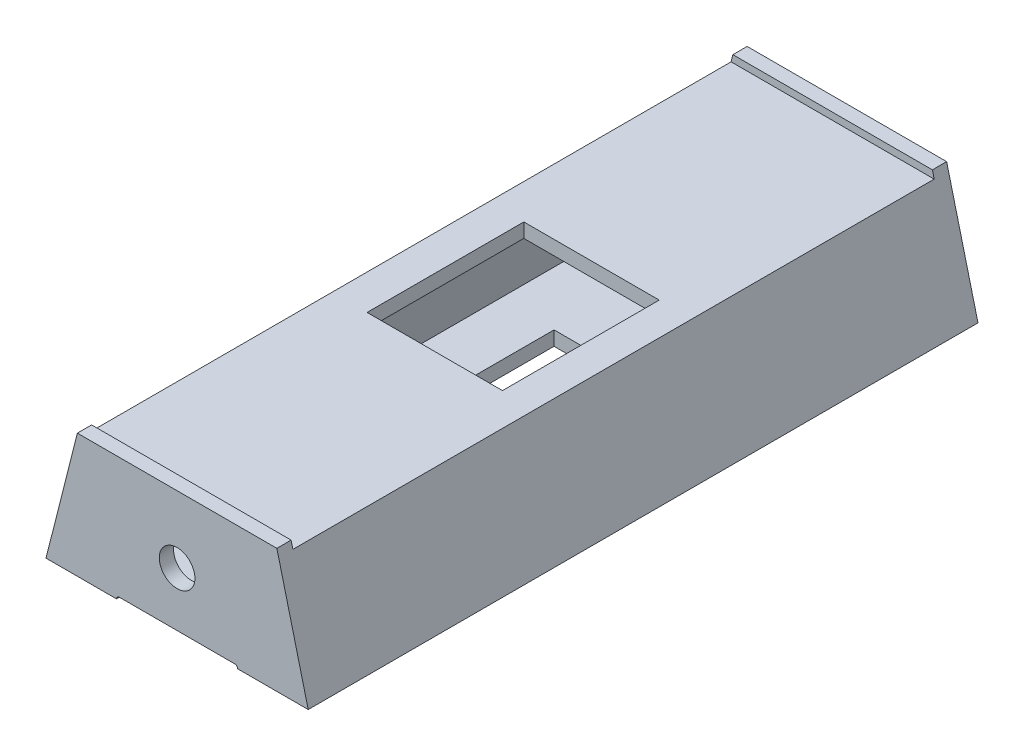
ISO-10303-21;
HEADER;
FILE_DESCRIPTION(('STEP AP214'),'2;1');
FILE_NAME('part.step','',(''),(''),'','','');
FILE_SCHEMA(('AUTOMOTIVE_DESIGN { 1 0 10303 214 1 1 1 1 }'));
ENDSEC;
DATA;
#1=APPLICATION_CONTEXT('core data for automotive mechanical design processes');
#2=APPLICATION_PROTOCOL_DEFINITION('international standard','automotive_design',2000,#1);
#3=PRODUCT_CONTEXT('',#1,'mechanical');
#4=PRODUCT('Part','Part','',(#3));
#5=PRODUCT_RELATED_PRODUCT_CATEGORY('part','',(#4));
#6=PRODUCT_DEFINITION_FORMATION('','',#4);
#7=PRODUCT_DEFINITION_CONTEXT('part definition',#1,'design');
#8=PRODUCT_DEFINITION('design','',#6,#7);
#9=PRODUCT_DEFINITION_SHAPE('','',#8);
#10=(LENGTH_UNIT() NAMED_UNIT(*) SI_UNIT(.MILLI.,.METRE.));
#11=(NAMED_UNIT(*) PLANE_ANGLE_UNIT() SI_UNIT($,.RADIAN.));
#12=(NAMED_UNIT(*) SI_UNIT($,.STERADIAN.) SOLID_ANGLE_UNIT());
#13=UNCERTAINTY_MEASURE_WITH_UNIT(LENGTH_MEASURE(1.E-05),#10,'distance_accuracy_value','');
#14=(GEOMETRIC_REPRESENTATION_CONTEXT(3) GLOBAL_UNCERTAINTY_ASSIGNED_CONTEXT((#13)) GLOBAL_UNIT_ASSIGNED_CONTEXT((#10,
#11,#12)) REPRESENTATION_CONTEXT('',''));
#15=CARTESIAN_POINT('',(0.,0.,0.));
#16=DIRECTION('',(0.,0.,1.));
#17=DIRECTION('',(1.,0.,0.));
#18=AXIS2_PLACEMENT_3D('',#15,#16,#17);
#19=CARTESIAN_POINT('',(-63.4783322972771,32.,460.));
#20=DIRECTION('',(0.,-1.,0.));
#21=DIRECTION('',(0.,0.,-1.));
#22=AXIS2_PLACEMENT_3D('',#19,#20,#21);
#23=PLANE('',#22);
#24=DIRECTION('',(-1.,0.,0.));
#25=VECTOR('',#24,1.);
#26=CARTESIAN_POINT('',(-63.4783322972771,32.,10.));
#27=LINE('',#26,#25);
#28=CARTESIAN_POINT('',(63.4783322972771,32.,10.));
#29=VERTEX_POINT('',#28);
#30=CARTESIAN_POINT('',(-63.4783322972771,32.,10.));
#31=VERTEX_POINT('',#30);
#32=EDGE_CURVE('E308',#29,#31,#27,.T.);
#33=ORIENTED_EDGE('',*,*,#32,.F.);
#34=DIRECTION('',(0.,0.,-1.));
#35=VECTOR('',#34,1.);
#36=CARTESIAN_POINT('',(63.4783322972771,32.,460.));
#37=LINE('',#36,#35);
#38=CARTESIAN_POINT('',(63.4783322972771,32.,460.));
#39=VERTEX_POINT('',#38);
#40=EDGE_CURVE('E329',#39,#29,#37,.T.);
#41=ORIENTED_EDGE('',*,*,#40,.F.);
#42=DIRECTION('',(-1.,0.,0.));
#43=VECTOR('',#42,1.);
#44=CARTESIAN_POINT('',(-63.4783322972771,32.,460.));
#45=LINE('',#44,#43);
#46=CARTESIAN_POINT('',(-63.4783322972771,32.,460.));
#47=VERTEX_POINT('',#46);
#48=EDGE_CURVE('E314',#39,#47,#45,.T.);
#49=ORIENTED_EDGE('',*,*,#48,.T.);
#50=DIRECTION('',(0.,0.,-1.));
#51=VECTOR('',#50,1.);
#52=CARTESIAN_POINT('',(-63.4783322972771,32.,460.));
#53=LINE('',#52,#51);
#54=EDGE_CURVE('E317',#47,#31,#53,.T.);
#55=ORIENTED_EDGE('',*,*,#54,.T.);
#56=EDGE_LOOP('',(#33,#41,#49,#55));
#57=FACE_BOUND('',#56,.T.);
#58=DIRECTION('',(1.,0.,0.));
#59=VECTOR('',#58,1.);
#60=CARTESIAN_POINT('',(-46.6940590360535,32.,290.));
#61=LINE('',#60,#59);
#62=CARTESIAN_POINT('',(-46.6940590360535,32.,290.));
#63=VERTEX_POINT('',#62);
#64=CARTESIAN_POINT('',(48.3059409639465,32.,290.));
#65=VERTEX_POINT('',#64);
#66=EDGE_CURVE('E202',#63,#65,#61,.T.);
#67=ORIENTED_EDGE('',*,*,#66,.T.);
#68=DIRECTION('',(0.,0.,-1.));
#69=VECTOR('',#68,1.);
#70=CARTESIAN_POINT('',(48.3059409639465,32.,290.));
#71=LINE('',#70,#69);
#72=CARTESIAN_POINT('',(48.3059409639465,32.,180.));
#73=VERTEX_POINT('',#72);
#74=EDGE_CURVE('E198',#65,#73,#71,.T.);
#75=ORIENTED_EDGE('',*,*,#74,.T.);
#76=DIRECTION('',(-1.,0.,0.));
#77=VECTOR('',#76,1.);
#78=CARTESIAN_POINT('',(-46.6940590360535,32.,180.));
#79=LINE('',#78,#77);
#80=CARTESIAN_POINT('',(-46.6940590360535,32.,180.));
#81=VERTEX_POINT('',#80);
#82=EDGE_CURVE('E201',#73,#81,#79,.T.);
#83=ORIENTED_EDGE('',*,*,#82,.T.);
#84=DIRECTION('',(0.,0.,1.));
#85=VECTOR('',#84,1.);
#86=CARTESIAN_POINT('',(-46.6940590360535,32.,290.));
#87=LINE('',#86,#85);
#88=EDGE_CURVE('E219',#81,#63,#87,.T.);
#89=ORIENTED_EDGE('',*,*,#88,.T.);
#90=EDGE_LOOP('',(#67,#75,#83,#89));
#91=FACE_BOUND('',#90,.T.);
#92=ADVANCED_FACE('F33',(#57,#91),#23,.T.);
#93=CARTESIAN_POINT('',(78.6507460903805,-28.,460.));
#94=DIRECTION('',(0.,1.,0.));
#95=DIRECTION('',(-1.,0.,0.));
#96=AXIS2_PLACEMENT_3D('',#93,#94,#95);
#97=PLANE('',#96);
#98=DIRECTION('',(1.,0.,0.));
#99=VECTOR('',#98,1.);
#100=CARTESIAN_POINT('',(78.6507460903805,-28.,10.));
#101=LINE('',#100,#99);
#102=CARTESIAN_POINT('',(-78.6507460903805,-28.,10.));
#103=VERTEX_POINT('',#102);
#104=CARTESIAN_POINT('',(78.6507460903805,-28.,10.));
#105=VERTEX_POINT('',#104);
#106=EDGE_CURVE('E320',#103,#105,#101,.T.);
#107=ORIENTED_EDGE('',*,*,#106,.F.);
#108=DIRECTION('',(0.,0.,-1.));
#109=VECTOR('',#108,1.);
#110=CARTESIAN_POINT('',(-78.6507460903805,-28.,460.));
#111=LINE('',#110,#109);
#112=CARTESIAN_POINT('',(-78.6507460903805,-28.,460.));
#113=VERTEX_POINT('',#112);
#114=EDGE_CURVE('E333',#113,#103,#111,.T.);
#115=ORIENTED_EDGE('',*,*,#114,.F.);
#116=DIRECTION('',(1.,0.,0.));
#117=VECTOR('',#116,1.);
#118=CARTESIAN_POINT('',(78.6507460903805,-28.,460.));
#119=LINE('',#118,#117);
#120=CARTESIAN_POINT('',(78.6507460903805,-28.,460.));
#121=VERTEX_POINT('',#120);
#122=EDGE_CURVE('E307',#113,#121,#119,.T.);
#123=ORIENTED_EDGE('',*,*,#122,.T.);
#124=DIRECTION('',(0.,0.,-1.));
#125=VECTOR('',#124,1.);
#126=CARTESIAN_POINT('',(78.6507460903805,-28.,460.));
#127=LINE('',#126,#125);
#128=EDGE_CURVE('E331',#121,#105,#127,.T.);
#129=ORIENTED_EDGE('',*,*,#128,.T.);
#130=EDGE_LOOP('',(#107,#115,#123,#129));
#131=FACE_BOUND('',#130,.T.);
#132=DIRECTION('',(1.,0.,0.));
#133=VECTOR('',#132,1.);
#134=CARTESIAN_POINT('',(-40.5,-28.,165.));
#135=LINE('',#134,#133);
#136=CARTESIAN_POINT('',(-40.5,-28.,165.));
#137=VERTEX_POINT('',#136);
#138=CARTESIAN_POINT('',(40.5,-28.,165.));
#139=VERTEX_POINT('',#138);
#140=EDGE_CURVE('E250',#137,#139,#135,.T.);
#141=ORIENTED_EDGE('',*,*,#140,.T.);
#142=DIRECTION('',(0.,0.,1.));
#143=VECTOR('',#142,1.);
#144=CARTESIAN_POINT('',(40.5,-28.,165.));
#145=LINE('',#144,#143);
#146=CARTESIAN_POINT('',(40.5,-28.,305.));
#147=VERTEX_POINT('',#146);
#148=EDGE_CURVE('E212',#139,#147,#145,.T.);
#149=ORIENTED_EDGE('',*,*,#148,.T.);
#150=DIRECTION('',(-1.,0.,0.));
#151=VECTOR('',#150,1.);
#152=CARTESIAN_POINT('',(-40.5,-28.,305.));
#153=LINE('',#152,#151);
#154=CARTESIAN_POINT('',(-40.5,-28.,305.));
#155=VERTEX_POINT('',#154);
#156=EDGE_CURVE('E230',#147,#155,#153,.T.);
#157=ORIENTED_EDGE('',*,*,#156,.T.);
#158=DIRECTION('',(0.,0.,-1.));
#159=VECTOR('',#158,1.);
#160=CARTESIAN_POINT('',(-40.5,-28.,165.));
#161=LINE('',#160,#159);
#162=EDGE_CURVE('E254',#155,#137,#161,.T.);
#163=ORIENTED_EDGE('',*,*,#162,.T.);
#164=EDGE_LOOP('',(#141,#149,#157,#163));
#165=FACE_BOUND('',#164,.T.);
#166=ADVANCED_FACE('F468',(#131,#165),#97,.T.);
#167=CARTESIAN_POINT('',(0.,-38.,0.));
#168=DIRECTION('',(0.,1.,0.));
#169=DIRECTION('',(0.,0.,1.));
#170=AXIS2_PLACEMENT_3D('',#167,#168,#169);
#171=PLANE('',#170);
#172=DIRECTION('',(0.,0.,1.));
#173=VECTOR('',#172,1.);
#174=CARTESIAN_POINT('',(40.5,-38.,470.));
#175=LINE('',#174,#173);
#176=CARTESIAN_POINT('',(40.5,-38.,0.));
#177=VERTEX_POINT('',#176);
#178=CARTESIAN_POINT('',(40.5,-38.,165.));
#179=VERTEX_POINT('',#178);
#180=EDGE_CURVE('E388',#177,#179,#175,.T.);
#181=ORIENTED_EDGE('',*,*,#180,.T.);
#182=DIRECTION('',(1.,0.,0.));
#183=VECTOR('',#182,1.);
#184=CARTESIAN_POINT('',(-40.5,-38.,165.));
#185=LINE('',#184,#183);
#186=CARTESIAN_POINT('',(-40.5,-38.,165.));
#187=VERTEX_POINT('',#186);
#188=EDGE_CURVE('E235',#187,#179,#185,.T.);
#189=ORIENTED_EDGE('',*,*,#188,.F.);
#190=DIRECTION('',(0.,0.,-1.));
#191=VECTOR('',#190,1.);
#192=CARTESIAN_POINT('',(-40.5,-38.,0.));
#193=LINE('',#192,#191);
#194=CARTESIAN_POINT('',(-40.5,-38.,0.));
#195=VERTEX_POINT('',#194);
#196=EDGE_CURVE('E383',#187,#195,#193,.T.);
#197=ORIENTED_EDGE('',*,*,#196,.T.);
#198=DIRECTION('',(1.,0.,0.));
#199=VECTOR('',#198,1.);
#200=CARTESIAN_POINT('',(-42.5,-38.,0.));
#201=LINE('',#200,#199);
#202=EDGE_CURVE('E265',#195,#177,#201,.T.);
#203=ORIENTED_EDGE('',*,*,#202,.T.);
#204=EDGE_LOOP('',(#181,#189,#197,#203));
#205=FACE_BOUND('',#204,.T.);
#206=ADVANCED_FACE('F474',(#205),#171,.F.);
#207=CARTESIAN_POINT('',(-92.,-40.,10.));
#208=DIRECTION('',(0.,1.,0.));
#209=DIRECTION('',(0.,0.,1.));
#210=AXIS2_PLACEMENT_3D('',#207,#208,#209);
#211=PLANE('',#210);
#212=DIRECTION('',(1.,0.,0.));
#213=VECTOR('',#212,1.);
#214=CARTESIAN_POINT('',(-92.,-40.,470.));
#215=LINE('',#214,#213);
#216=CARTESIAN_POINT('',(42.5,-40.,470.));
#217=VERTEX_POINT('',#216);
#218=CARTESIAN_POINT('',(92.,-40.,470.));
#219=VERTEX_POINT('',#218);
#220=EDGE_CURVE('E284',#217,#219,#215,.T.);
#221=ORIENTED_EDGE('',*,*,#220,.F.);
#222=DIRECTION('',(0.,0.,1.));
#223=VECTOR('',#222,1.);
#224=CARTESIAN_POINT('',(42.5,-40.,0.));
#225=LINE('',#224,#223);
#226=CARTESIAN_POINT('',(42.5,-40.,0.));
#227=VERTEX_POINT('',#226);
#228=EDGE_CURVE('E238',#227,#217,#225,.T.);
#229=ORIENTED_EDGE('',*,*,#228,.F.);
#230=DIRECTION('',(1.,0.,0.));
#231=VECTOR('',#230,1.);
#232=CARTESIAN_POINT('',(-92.,-40.,0.));
#233=LINE('',#232,#231);
#234=CARTESIAN_POINT('',(92.,-40.,0.));
#235=VERTEX_POINT('',#234);
#236=EDGE_CURVE('E365',#227,#235,#233,.T.);
#237=ORIENTED_EDGE('',*,*,#236,.T.);
#238=DIRECTION('',(0.,0.,-1.));
#239=VECTOR('',#238,1.);
#240=CARTESIAN_POINT('',(92.,-40.,10.));
#241=LINE('',#240,#239);
#242=EDGE_CURVE('E377',#219,#235,#241,.T.);
#243=ORIENTED_EDGE('',*,*,#242,.F.);
#244=EDGE_LOOP('',(#221,#229,#237,#243));
#245=FACE_BOUND('',#244,.T.);
#246=ADVANCED_FACE('F425',(#245),#211,.F.);
#247=CARTESIAN_POINT('',(0.,0.,10.));
#248=DIRECTION('',(0.,0.,1.));
#249=DIRECTION('',(1.,0.,0.));
#250=AXIS2_PLACEMENT_3D('',#247,#248,#249);
#251=PLANE('',#250);
#252=CARTESIAN_POINT('',(0.,0.,10.));
#253=DIRECTION('',(0.,0.,1.));
#254=DIRECTION('',(1.,0.,0.));
#255=AXIS2_PLACEMENT_3D('',#252,#253,#254);
#256=CIRCLE('',#255,14.);
#257=CARTESIAN_POINT('',(14.,0.,10.));
#258=VERTEX_POINT('',#257);
#259=EDGE_CURVE('E348',#258,#258,#256,.F.);
#260=ORIENTED_EDGE('',*,*,#259,.T.);
#261=EDGE_LOOP('',(#260));
#262=FACE_BOUND('',#261,.T.);
#263=ORIENTED_EDGE('',*,*,#32,.T.);
#264=DIRECTION('',(-0.245156736408936,-0.969483457617158,0.));
#265=VECTOR('',#264,1.);
#266=CARTESIAN_POINT('',(-78.6507460903805,-28.,10.));
#267=LINE('',#266,#265);
#268=EDGE_CURVE('E303',#31,#103,#267,.T.);
#269=ORIENTED_EDGE('',*,*,#268,.T.);
#270=ORIENTED_EDGE('',*,*,#106,.T.);
#271=DIRECTION('',(-0.245156736408937,0.969483457617158,0.));
#272=VECTOR('',#271,1.);
#273=CARTESIAN_POINT('',(63.4783322972771,32.,10.));
#274=LINE('',#273,#272);
#275=EDGE_CURVE('E323',#105,#29,#274,.T.);
#276=ORIENTED_EDGE('',*,*,#275,.T.);
#277=EDGE_LOOP('',(#263,#269,#270,#276));
#278=FACE_BOUND('',#277,.T.);
#279=ADVANCED_FACE('F456',(#262,#278),#251,.T.);
#280=CARTESIAN_POINT('',(-70.,47.,10.));
#281=DIRECTION('',(0.969483457617158,-0.245156736408936,0.));
#282=DIRECTION('',(0.245156736408936,0.969483457617158,0.));
#283=AXIS2_PLACEMENT_3D('',#280,#281,#282);
#284=PLANE('',#283);
#285=DIRECTION('',(-0.245156736408936,-0.969483457617158,0.));
#286=VECTOR('',#285,1.);
#287=CARTESIAN_POINT('',(-70.,47.,0.));
#288=LINE('',#287,#286);
#289=CARTESIAN_POINT('',(-70.,47.,0.));
#290=VERTEX_POINT('',#289);
#291=CARTESIAN_POINT('',(-92.,-40.,0.));
#292=VERTEX_POINT('',#291);
#293=EDGE_CURVE('E352',#290,#292,#288,.T.);
#294=ORIENTED_EDGE('',*,*,#293,.T.);
#295=DIRECTION('',(0.,0.,-1.));
#296=VECTOR('',#295,1.);
#297=CARTESIAN_POINT('',(-92.,-40.,10.));
#298=LINE('',#297,#296);
#299=CARTESIAN_POINT('',(-92.,-40.,470.));
#300=VERTEX_POINT('',#299);
#301=EDGE_CURVE('E380',#300,#292,#298,.T.);
#302=ORIENTED_EDGE('',*,*,#301,.F.);
#303=DIRECTION('',(-0.245156736408936,-0.969483457617158,0.));
#304=VECTOR('',#303,1.);
#305=CARTESIAN_POINT('',(-70.,47.,470.));
#306=LINE('',#305,#304);
#307=CARTESIAN_POINT('',(-70.,47.,470.));
#308=VERTEX_POINT('',#307);
#309=EDGE_CURVE('E288',#308,#300,#306,.T.);
#310=ORIENTED_EDGE('',*,*,#309,.F.);
#311=DIRECTION('',(0.,0.,-1.));
#312=VECTOR('',#311,1.);
#313=CARTESIAN_POINT('',(-70.,47.,470.));
#314=LINE('',#313,#312);
#315=CARTESIAN_POINT('',(-70.,47.,460.));
#316=VERTEX_POINT('',#315);
#317=EDGE_CURVE('E291',#308,#316,#314,.T.);
#318=ORIENTED_EDGE('',*,*,#317,.T.);
#319=DIRECTION('',(-0.245156736408936,-0.969483457617158,0.));
#320=VECTOR('',#319,1.);
#321=CARTESIAN_POINT('',(-70.,47.,460.));
#322=LINE('',#321,#320);
#323=CARTESIAN_POINT('',(-71.264367816092,42.,460.));
#324=VERTEX_POINT('',#323);
#325=EDGE_CURVE('E295',#316,#324,#322,.T.);
#326=ORIENTED_EDGE('',*,*,#325,.T.);
#327=DIRECTION('',(0.,0.,-1.));
#328=VECTOR('',#327,1.);
#329=CARTESIAN_POINT('',(-71.264367816092,42.,460.));
#330=LINE('',#329,#328);
#331=CARTESIAN_POINT('',(-71.264367816092,42.,10.));
#332=VERTEX_POINT('',#331);
#333=EDGE_CURVE('E340',#324,#332,#330,.T.);
#334=ORIENTED_EDGE('',*,*,#333,.T.);
#335=DIRECTION('',(-0.245156736408936,-0.969483457617158,0.));
#336=VECTOR('',#335,1.);
#337=CARTESIAN_POINT('',(-70.,47.,10.));
#338=LINE('',#337,#336);
#339=CARTESIAN_POINT('',(-70.,47.,10.));
#340=VERTEX_POINT('',#339);
#341=EDGE_CURVE('E355',#340,#332,#338,.T.);
#342=ORIENTED_EDGE('',*,*,#341,.F.);
#343=DIRECTION('',(0.,0.,-1.));
#344=VECTOR('',#343,1.);
#345=CARTESIAN_POINT('',(-70.,47.,10.));
#346=LINE('',#345,#344);
#347=EDGE_CURVE('E362',#340,#290,#346,.T.);
#348=ORIENTED_EDGE('',*,*,#347,.T.);
#349=EDGE_LOOP('',(#294,#302,#310,#318,#326,#334,#342,#348));
#350=FACE_BOUND('',#349,.T.);
#351=ADVANCED_FACE('F439',(#350),#284,.F.);
#352=CARTESIAN_POINT('',(-42.5,-40.,0.));
#353=VERTEX_POINT('',#352);
#354=EDGE_CURVE('E366',#292,#353,#233,.T.);
#355=ORIENTED_EDGE('',*,*,#354,.T.);
#356=DIRECTION('',(0.,0.,-1.));
#357=VECTOR('',#356,1.);
#358=CARTESIAN_POINT('',(-42.5,-40.,0.));
#359=LINE('',#358,#357);
#360=CARTESIAN_POINT('',(-42.5,-40.,470.));
#361=VERTEX_POINT('',#360);
#362=EDGE_CURVE('E266',#361,#353,#359,.T.);
#363=ORIENTED_EDGE('',*,*,#362,.F.);
#364=EDGE_CURVE('E280',#300,#361,#215,.T.);
#365=ORIENTED_EDGE('',*,*,#364,.F.);
#366=ORIENTED_EDGE('',*,*,#301,.T.);
#367=EDGE_LOOP('',(#355,#363,#365,#366));
#368=FACE_BOUND('',#367,.T.);
#369=ADVANCED_FACE('F404',(#368),#211,.F.);
#370=CARTESIAN_POINT('',(70.,47.,10.));
#371=DIRECTION('',(-0.969483457617158,-0.245156736408936,0.));
#372=DIRECTION('',(0.245156736408936,-0.969483457617158,0.));
#373=AXIS2_PLACEMENT_3D('',#370,#371,#372);
#374=PLANE('',#373);
#375=DIRECTION('',(-0.245156736408936,0.969483457617158,0.));
#376=VECTOR('',#375,1.);
#377=CARTESIAN_POINT('',(70.,47.,0.));
#378=LINE('',#377,#376);
#379=CARTESIAN_POINT('',(70.,47.,0.));
#380=VERTEX_POINT('',#379);
#381=EDGE_CURVE('E369',#235,#380,#378,.T.);
#382=ORIENTED_EDGE('',*,*,#381,.T.);
#383=DIRECTION('',(0.,0.,-1.));
#384=VECTOR('',#383,1.);
#385=CARTESIAN_POINT('',(70.,47.,10.));
#386=LINE('',#385,#384);
#387=CARTESIAN_POINT('',(70.,47.,10.));
#388=VERTEX_POINT('',#387);
#389=EDGE_CURVE('E374',#388,#380,#386,.T.);
#390=ORIENTED_EDGE('',*,*,#389,.F.);
#391=DIRECTION('',(-0.245156736408936,0.969483457617158,0.));
#392=VECTOR('',#391,1.);
#393=CARTESIAN_POINT('',(70.,47.,10.));
#394=LINE('',#393,#392);
#395=CARTESIAN_POINT('',(71.264367816092,42.,10.));
#396=VERTEX_POINT('',#395);
#397=EDGE_CURVE('E357',#396,#388,#394,.T.);
#398=ORIENTED_EDGE('',*,*,#397,.F.);
#399=DIRECTION('',(0.,0.,-1.));
#400=VECTOR('',#399,1.);
#401=CARTESIAN_POINT('',(71.264367816092,42.,460.));
#402=LINE('',#401,#400);
#403=CARTESIAN_POINT('',(71.264367816092,42.,460.));
#404=VERTEX_POINT('',#403);
#405=EDGE_CURVE('E345',#404,#396,#402,.T.);
#406=ORIENTED_EDGE('',*,*,#405,.F.);
#407=DIRECTION('',(-0.245156736408936,0.969483457617158,0.));
#408=VECTOR('',#407,1.);
#409=CARTESIAN_POINT('',(92.,-40.,460.));
#410=LINE('',#409,#408);
#411=CARTESIAN_POINT('',(70.,47.,460.));
#412=VERTEX_POINT('',#411);
#413=EDGE_CURVE('E279',#404,#412,#410,.T.);
#414=ORIENTED_EDGE('',*,*,#413,.T.);
#415=DIRECTION('',(0.,0.,-1.));
#416=VECTOR('',#415,1.);
#417=CARTESIAN_POINT('',(70.,47.,470.));
#418=LINE('',#417,#416);
#419=CARTESIAN_POINT('',(70.,47.,470.));
#420=VERTEX_POINT('',#419);
#421=EDGE_CURVE('E300',#420,#412,#418,.T.);
#422=ORIENTED_EDGE('',*,*,#421,.F.);
#423=DIRECTION('',(-0.245156736408936,0.969483457617158,0.));
#424=VECTOR('',#423,1.);
#425=CARTESIAN_POINT('',(92.,-40.,470.));
#426=LINE('',#425,#424);
#427=EDGE_CURVE('E283',#219,#420,#426,.T.);
#428=ORIENTED_EDGE('',*,*,#427,.F.);
#429=ORIENTED_EDGE('',*,*,#242,.T.);
#430=EDGE_LOOP('',(#382,#390,#398,#406,#414,#422,#428,#429));
#431=FACE_BOUND('',#430,.T.);
#432=ADVANCED_FACE('F430',(#431),#374,.F.);
#433=CARTESIAN_POINT('',(70.,47.,10.));
#434=DIRECTION('',(0.,-1.,0.));
#435=DIRECTION('',(0.,0.,-1.));
#436=AXIS2_PLACEMENT_3D('',#433,#434,#435);
#437=PLANE('',#436);
#438=DIRECTION('',(-1.,0.,0.));
#439=VECTOR('',#438,1.);
#440=CARTESIAN_POINT('',(70.,47.,0.));
#441=LINE('',#440,#439);
#442=EDGE_CURVE('E358',#380,#290,#441,.T.);
#443=ORIENTED_EDGE('',*,*,#442,.T.);
#444=ORIENTED_EDGE('',*,*,#347,.F.);
#445=DIRECTION('',(-1.,0.,0.));
#446=VECTOR('',#445,1.);
#447=CARTESIAN_POINT('',(70.,47.,10.));
#448=LINE('',#447,#446);
#449=EDGE_CURVE('E360',#388,#340,#448,.T.);
#450=ORIENTED_EDGE('',*,*,#449,.F.);
#451=ORIENTED_EDGE('',*,*,#389,.T.);
#452=EDGE_LOOP('',(#443,#444,#450,#451));
#453=FACE_BOUND('',#452,.T.);
#454=ADVANCED_FACE('F444',(#453),#437,.F.);
#455=DIRECTION('',(-1.,0.,0.));
#456=VECTOR('',#455,1.);
#457=CARTESIAN_POINT('',(-71.264367816092,42.,10.));
#458=LINE('',#457,#456);
#459=EDGE_CURVE('E336',#396,#332,#458,.T.);
#460=ORIENTED_EDGE('',*,*,#459,.F.);
#461=ORIENTED_EDGE('',*,*,#397,.T.);
#462=ORIENTED_EDGE('',*,*,#449,.T.);
#463=ORIENTED_EDGE('',*,*,#341,.T.);
#464=EDGE_LOOP('',(#460,#461,#462,#463));
#465=FACE_BOUND('',#464,.T.);
#466=ADVANCED_FACE('F453',(#465),#251,.T.);
#467=CARTESIAN_POINT('',(0.,0.,0.));
#468=DIRECTION('',(0.,0.,1.));
#469=DIRECTION('',(1.,0.,0.));
#470=AXIS2_PLACEMENT_3D('',#467,#468,#469);
#471=PLANE('',#470);
#472=ORIENTED_EDGE('',*,*,#236,.F.);
#473=CARTESIAN_POINT('',(40.5,-40.,0.));
#474=DIRECTION('',(0.,0.,1.));
#475=DIRECTION('',(1.,0.,0.));
#476=AXIS2_PLACEMENT_3D('',#473,#474,#475);
#477=CIRCLE('',#476,2.);
#478=EDGE_CURVE('E393',#227,#177,#477,.T.);
#479=ORIENTED_EDGE('',*,*,#478,.T.);
#480=ORIENTED_EDGE('',*,*,#202,.F.);
#481=CARTESIAN_POINT('',(-40.5,-40.,0.));
#482=DIRECTION('',(0.,0.,1.));
#483=DIRECTION('',(1.,0.,0.));
#484=AXIS2_PLACEMENT_3D('',#481,#482,#483);
#485=CIRCLE('',#484,2.);
#486=EDGE_CURVE('E41',#195,#353,#485,.T.);
#487=ORIENTED_EDGE('',*,*,#486,.T.);
#488=ORIENTED_EDGE('',*,*,#354,.F.);
#489=ORIENTED_EDGE('',*,*,#293,.F.);
#490=ORIENTED_EDGE('',*,*,#442,.F.);
#491=ORIENTED_EDGE('',*,*,#381,.F.);
#492=EDGE_LOOP('',(#472,#479,#480,#487,#488,#489,#490,#491));
#493=FACE_BOUND('',#492,.T.);
#494=CARTESIAN_POINT('',(0.,0.,0.));
#495=DIRECTION('',(0.,0.,-1.));
#496=DIRECTION('',(-1.,0.,0.));
#497=AXIS2_PLACEMENT_3D('',#494,#495,#496);
#498=CIRCLE('',#497,14.);
#499=CARTESIAN_POINT('',(-14.,0.,0.));
#500=VERTEX_POINT('',#499);
#501=EDGE_CURVE('E349',#500,#500,#498,.T.);
#502=ORIENTED_EDGE('',*,*,#501,.F.);
#503=EDGE_LOOP('',(#502));
#504=FACE_BOUND('',#503,.T.);
#505=ADVANCED_FACE('F398',(#493,#504),#471,.F.);
#506=CARTESIAN_POINT('',(0.,0.,10.001));
#507=DIRECTION('',(0.,0.,-1.));
#508=DIRECTION('',(-1.,0.,0.));
#509=AXIS2_PLACEMENT_3D('',#506,#507,#508);
#510=CYLINDRICAL_SURFACE('',#509,14.);
#511=ORIENTED_EDGE('',*,*,#259,.F.);
#512=EDGE_LOOP('',(#511));
#513=FACE_BOUND('',#512,.T.);
#514=ORIENTED_EDGE('',*,*,#501,.T.);
#515=EDGE_LOOP('',(#514));
#516=FACE_BOUND('',#515,.T.);
#517=ADVANCED_FACE('F461',(#513,#516),#510,.F.);
#518=CARTESIAN_POINT('',(-71.264367816092,42.,460.));
#519=DIRECTION('',(0.,-1.,0.));
#520=DIRECTION('',(0.,0.,-1.));
#521=AXIS2_PLACEMENT_3D('',#518,#519,#520);
#522=PLANE('',#521);
#523=DIRECTION('',(-1.,0.,0.));
#524=VECTOR('',#523,1.);
#525=CARTESIAN_POINT('',(-46.6940590360535,42.,180.));
#526=LINE('',#525,#524);
#527=CARTESIAN_POINT('',(48.3059409639465,42.,180.));
#528=VERTEX_POINT('',#527);
#529=CARTESIAN_POINT('',(-46.6940590360535,42.,180.));
#530=VERTEX_POINT('',#529);
#531=EDGE_CURVE('E53',#528,#530,#526,.T.);
#532=ORIENTED_EDGE('',*,*,#531,.F.);
#533=DIRECTION('',(0.,0.,-1.));
#534=VECTOR('',#533,1.);
#535=CARTESIAN_POINT('',(48.3059409639465,42.,290.));
#536=LINE('',#535,#534);
#537=CARTESIAN_POINT('',(48.3059409639465,42.,290.));
#538=VERTEX_POINT('',#537);
#539=EDGE_CURVE('E196',#538,#528,#536,.T.);
#540=ORIENTED_EDGE('',*,*,#539,.F.);
#541=DIRECTION('',(1.,0.,0.));
#542=VECTOR('',#541,1.);
#543=CARTESIAN_POINT('',(-46.6940590360535,42.,290.));
#544=LINE('',#543,#542);
#545=CARTESIAN_POINT('',(-46.6940590360535,42.,290.));
#546=VERTEX_POINT('',#545);
#547=EDGE_CURVE('E205',#546,#538,#544,.T.);
#548=ORIENTED_EDGE('',*,*,#547,.F.);
#549=DIRECTION('',(0.,0.,1.));
#550=VECTOR('',#549,1.);
#551=CARTESIAN_POINT('',(-46.6940590360535,42.,290.));
#552=LINE('',#551,#550);
#553=EDGE_CURVE('E213',#530,#546,#552,.T.);
#554=ORIENTED_EDGE('',*,*,#553,.F.);
#555=EDGE_LOOP('',(#532,#540,#548,#554));
#556=FACE_BOUND('',#555,.T.);
#557=ORIENTED_EDGE('',*,*,#459,.T.);
#558=ORIENTED_EDGE('',*,*,#333,.F.);
#559=DIRECTION('',(-1.,0.,0.));
#560=VECTOR('',#559,1.);
#561=CARTESIAN_POINT('',(-71.264367816092,42.,460.));
#562=LINE('',#561,#560);
#563=EDGE_CURVE('E337',#404,#324,#562,.T.);
#564=ORIENTED_EDGE('',*,*,#563,.F.);
#565=ORIENTED_EDGE('',*,*,#405,.T.);
#566=EDGE_LOOP('',(#557,#558,#564,#565));
#567=FACE_BOUND('',#566,.T.);
#568=ADVANCED_FACE('F215',(#556,#567),#522,.F.);
#569=CARTESIAN_POINT('',(-78.6507460903805,-28.,460.));
#570=DIRECTION('',(0.969483457617158,-0.245156736408936,0.));
#571=DIRECTION('',(0.245156736408936,0.969483457617158,0.));
#572=AXIS2_PLACEMENT_3D('',#569,#570,#571);
#573=PLANE('',#572);
#574=ORIENTED_EDGE('',*,*,#268,.F.);
#575=ORIENTED_EDGE('',*,*,#54,.F.);
#576=DIRECTION('',(-0.245156736408936,-0.969483457617158,0.));
#577=VECTOR('',#576,1.);
#578=CARTESIAN_POINT('',(-78.6507460903805,-28.,460.));
#579=LINE('',#578,#577);
#580=EDGE_CURVE('E304',#47,#113,#579,.T.);
#581=ORIENTED_EDGE('',*,*,#580,.T.);
#582=ORIENTED_EDGE('',*,*,#114,.T.);
#583=EDGE_LOOP('',(#574,#575,#581,#582));
#584=FACE_BOUND('',#583,.T.);
#585=ADVANCED_FACE('F485',(#584),#573,.T.);
#586=CARTESIAN_POINT('',(63.4783322972771,32.,460.));
#587=DIRECTION('',(-0.969483457617158,-0.245156736408937,0.));
#588=DIRECTION('',(0.245156736408937,-0.969483457617158,0.));
#589=AXIS2_PLACEMENT_3D('',#586,#587,#588);
#590=PLANE('',#589);
#591=ORIENTED_EDGE('',*,*,#275,.F.);
#592=ORIENTED_EDGE('',*,*,#128,.F.);
#593=DIRECTION('',(-0.245156736408937,0.969483457617158,0.));
#594=VECTOR('',#593,1.);
#595=CARTESIAN_POINT('',(63.4783322972771,32.,460.));
#596=LINE('',#595,#594);
#597=EDGE_CURVE('E311',#121,#39,#596,.T.);
#598=ORIENTED_EDGE('',*,*,#597,.T.);
#599=ORIENTED_EDGE('',*,*,#40,.T.);
#600=EDGE_LOOP('',(#591,#592,#598,#599));
#601=FACE_BOUND('',#600,.T.);
#602=ADVANCED_FACE('F482',(#601),#590,.T.);
#603=CARTESIAN_POINT('',(0.,0.,460.));
#604=DIRECTION('',(0.,0.,1.));
#605=DIRECTION('',(1.,0.,0.));
#606=AXIS2_PLACEMENT_3D('',#603,#604,#605);
#607=PLANE('',#606);
#608=CARTESIAN_POINT('',(0.,0.,460.));
#609=DIRECTION('',(0.,0.,1.));
#610=DIRECTION('',(1.,0.,0.));
#611=AXIS2_PLACEMENT_3D('',#608,#609,#610);
#612=CIRCLE('',#611,12.5);
#613=CARTESIAN_POINT('',(12.5,0.,460.));
#614=VERTEX_POINT('',#613);
#615=EDGE_CURVE('E276',#614,#614,#612,.F.);
#616=ORIENTED_EDGE('',*,*,#615,.F.);
#617=EDGE_LOOP('',(#616));
#618=FACE_BOUND('',#617,.T.);
#619=ORIENTED_EDGE('',*,*,#122,.F.);
#620=ORIENTED_EDGE('',*,*,#580,.F.);
#621=ORIENTED_EDGE('',*,*,#48,.F.);
#622=ORIENTED_EDGE('',*,*,#597,.F.);
#623=EDGE_LOOP('',(#619,#620,#621,#622));
#624=FACE_BOUND('',#623,.T.);
#625=ADVANCED_FACE('F484',(#618,#624),#607,.F.);
#626=ORIENTED_EDGE('',*,*,#413,.F.);
#627=ORIENTED_EDGE('',*,*,#563,.T.);
#628=ORIENTED_EDGE('',*,*,#325,.F.);
#629=DIRECTION('',(-1.,0.,0.));
#630=VECTOR('',#629,1.);
#631=CARTESIAN_POINT('',(70.,47.,460.));
#632=LINE('',#631,#630);
#633=EDGE_CURVE('E293',#412,#316,#632,.T.);
#634=ORIENTED_EDGE('',*,*,#633,.F.);
#635=EDGE_LOOP('',(#626,#627,#628,#634));
#636=FACE_BOUND('',#635,.T.);
#637=ADVANCED_FACE('F452',(#636),#607,.F.);
#638=CARTESIAN_POINT('',(70.,47.,470.));
#639=DIRECTION('',(0.,-1.,0.));
#640=DIRECTION('',(0.,0.,-1.));
#641=AXIS2_PLACEMENT_3D('',#638,#639,#640);
#642=PLANE('',#641);
#643=ORIENTED_EDGE('',*,*,#633,.T.);
#644=ORIENTED_EDGE('',*,*,#317,.F.);
#645=DIRECTION('',(-1.,0.,0.));
#646=VECTOR('',#645,1.);
#647=CARTESIAN_POINT('',(70.,47.,470.));
#648=LINE('',#647,#646);
#649=EDGE_CURVE('E286',#420,#308,#648,.T.);
#650=ORIENTED_EDGE('',*,*,#649,.F.);
#651=ORIENTED_EDGE('',*,*,#421,.T.);
#652=EDGE_LOOP('',(#643,#644,#650,#651));
#653=FACE_BOUND('',#652,.T.);
#654=ADVANCED_FACE('F435',(#653),#642,.F.);
#655=CARTESIAN_POINT('',(0.,0.,470.));
#656=DIRECTION('',(0.,0.,1.));
#657=DIRECTION('',(1.,0.,0.));
#658=AXIS2_PLACEMENT_3D('',#655,#656,#657);
#659=PLANE('',#658);
#660=DIRECTION('',(-1.,0.,0.));
#661=VECTOR('',#660,1.);
#662=CARTESIAN_POINT('',(-42.5,-38.,470.));
#663=LINE('',#662,#661);
#664=CARTESIAN_POINT('',(40.5,-38.,470.));
#665=VERTEX_POINT('',#664);
#666=CARTESIAN_POINT('',(-40.5,-38.,470.));
#667=VERTEX_POINT('',#666);
#668=EDGE_CURVE('E262',#665,#667,#663,.T.);
#669=ORIENTED_EDGE('',*,*,#668,.F.);
#670=CARTESIAN_POINT('',(40.5,-40.,470.));
#671=DIRECTION('',(0.,0.,1.));
#672=DIRECTION('',(1.,0.,0.));
#673=AXIS2_PLACEMENT_3D('',#670,#671,#672);
#674=CIRCLE('',#673,2.);
#675=EDGE_CURVE('E391',#665,#217,#674,.F.);
#676=ORIENTED_EDGE('',*,*,#675,.T.);
#677=ORIENTED_EDGE('',*,*,#220,.T.);
#678=ORIENTED_EDGE('',*,*,#427,.T.);
#679=ORIENTED_EDGE('',*,*,#649,.T.);
#680=ORIENTED_EDGE('',*,*,#309,.T.);
#681=ORIENTED_EDGE('',*,*,#364,.T.);
#682=CARTESIAN_POINT('',(-40.5,-40.,470.));
#683=DIRECTION('',(0.,0.,1.));
#684=DIRECTION('',(1.,0.,0.));
#685=AXIS2_PLACEMENT_3D('',#682,#683,#684);
#686=CIRCLE('',#685,2.);
#687=EDGE_CURVE('E11',#361,#667,#686,.F.);
#688=ORIENTED_EDGE('',*,*,#687,.T.);
#689=EDGE_LOOP('',(#669,#676,#677,#678,#679,#680,#681,#688));
#690=FACE_BOUND('',#689,.T.);
#691=CARTESIAN_POINT('',(0.,0.,470.));
#692=DIRECTION('',(0.,0.,1.));
#693=DIRECTION('',(1.,0.,0.));
#694=AXIS2_PLACEMENT_3D('',#691,#692,#693);
#695=CIRCLE('',#694,12.5);
#696=CARTESIAN_POINT('',(12.5,0.,470.));
#697=VERTEX_POINT('',#696);
#698=EDGE_CURVE('E269',#697,#697,#695,.T.);
#699=ORIENTED_EDGE('',*,*,#698,.F.);
#700=EDGE_LOOP('',(#699));
#701=FACE_BOUND('',#700,.T.);
#702=ADVANCED_FACE('F411',(#690,#701),#659,.T.);
#703=CARTESIAN_POINT('',(0.,0.,-0.000999999999973245));
#704=DIRECTION('',(0.,0.,1.));
#705=DIRECTION('',(1.,0.,0.));
#706=AXIS2_PLACEMENT_3D('',#703,#704,#705);
#707=CYLINDRICAL_SURFACE('',#706,12.5);
#708=ORIENTED_EDGE('',*,*,#698,.T.);
#709=EDGE_LOOP('',(#708));
#710=FACE_BOUND('',#709,.T.);
#711=ORIENTED_EDGE('',*,*,#615,.T.);
#712=EDGE_LOOP('',(#711));
#713=FACE_BOUND('',#712,.T.);
#714=ADVANCED_FACE('F517',(#710,#713),#707,.F.);
#715=CARTESIAN_POINT('',(-40.5,-38.,305.));
#716=VERTEX_POINT('',#715);
#717=EDGE_CURVE('E384',#667,#716,#193,.T.);
#718=ORIENTED_EDGE('',*,*,#717,.T.);
#719=DIRECTION('',(-1.,0.,0.));
#720=VECTOR('',#719,1.);
#721=CARTESIAN_POINT('',(-40.5,-38.,305.));
#722=LINE('',#721,#720);
#723=CARTESIAN_POINT('',(40.5,-38.,305.));
#724=VERTEX_POINT('',#723);
#725=EDGE_CURVE('E242',#724,#716,#722,.T.);
#726=ORIENTED_EDGE('',*,*,#725,.F.);
#727=EDGE_CURVE('E387',#724,#665,#175,.T.);
#728=ORIENTED_EDGE('',*,*,#727,.T.);
#729=ORIENTED_EDGE('',*,*,#668,.T.);
#730=EDGE_LOOP('',(#718,#726,#728,#729));
#731=FACE_BOUND('',#730,.T.);
#732=ADVANCED_FACE('F414',(#731),#171,.F.);
#733=CARTESIAN_POINT('',(40.5,-40.,0.));
#734=DIRECTION('',(0.,0.,-1.));
#735=DIRECTION('',(-1.,0.,0.));
#736=AXIS2_PLACEMENT_3D('',#733,#734,#735);
#737=CYLINDRICAL_SURFACE('',#736,2.);
#738=ORIENTED_EDGE('',*,*,#478,.F.);
#739=ORIENTED_EDGE('',*,*,#228,.T.);
#740=ORIENTED_EDGE('',*,*,#675,.F.);
#741=ORIENTED_EDGE('',*,*,#727,.F.);
#742=DIRECTION('',(0.,0.,1.));
#743=VECTOR('',#742,1.);
#744=CARTESIAN_POINT('',(40.5,-38.,165.));
#745=LINE('',#744,#743);
#746=EDGE_CURVE('E244',#179,#724,#745,.T.);
#747=ORIENTED_EDGE('',*,*,#746,.F.);
#748=ORIENTED_EDGE('',*,*,#180,.F.);
#749=EDGE_LOOP('',(#738,#739,#740,#741,#747,#748));
#750=FACE_BOUND('',#749,.T.);
#751=ADVANCED_FACE('F421',(#750),#737,.F.);
#752=CARTESIAN_POINT('',(-40.5,-40.,0.));
#753=DIRECTION('',(0.,0.,1.));
#754=DIRECTION('',(1.,0.,0.));
#755=AXIS2_PLACEMENT_3D('',#752,#753,#754);
#756=CYLINDRICAL_SURFACE('',#755,2.);
#757=ORIENTED_EDGE('',*,*,#687,.F.);
#758=ORIENTED_EDGE('',*,*,#362,.T.);
#759=ORIENTED_EDGE('',*,*,#486,.F.);
#760=ORIENTED_EDGE('',*,*,#196,.F.);
#761=DIRECTION('',(0.,0.,-1.));
#762=VECTOR('',#761,1.);
#763=CARTESIAN_POINT('',(-40.5,-38.,165.));
#764=LINE('',#763,#762);
#765=EDGE_CURVE('E239',#716,#187,#764,.T.);
#766=ORIENTED_EDGE('',*,*,#765,.F.);
#767=ORIENTED_EDGE('',*,*,#717,.F.);
#768=EDGE_LOOP('',(#757,#758,#759,#760,#766,#767));
#769=FACE_BOUND('',#768,.T.);
#770=ADVANCED_FACE('F35',(#769),#756,.F.);
#771=CARTESIAN_POINT('',(40.5,47.001,165.));
#772=DIRECTION('',(1.,0.,0.));
#773=DIRECTION('',(0.,0.,-1.));
#774=AXIS2_PLACEMENT_3D('',#771,#772,#773);
#775=PLANE('',#774);
#776=DIRECTION('',(0.,-1.,0.));
#777=VECTOR('',#776,1.);
#778=CARTESIAN_POINT('',(40.5,47.001,165.));
#779=LINE('',#778,#777);
#780=EDGE_CURVE('E253',#139,#179,#779,.T.);
#781=ORIENTED_EDGE('',*,*,#780,.T.);
#782=ORIENTED_EDGE('',*,*,#746,.T.);
#783=DIRECTION('',(0.,-1.,0.));
#784=VECTOR('',#783,1.);
#785=CARTESIAN_POINT('',(40.5,47.001,305.));
#786=LINE('',#785,#784);
#787=EDGE_CURVE('E249',#147,#724,#786,.T.);
#788=ORIENTED_EDGE('',*,*,#787,.F.);
#789=ORIENTED_EDGE('',*,*,#148,.F.);
#790=EDGE_LOOP('',(#781,#782,#788,#789));
#791=FACE_BOUND('',#790,.T.);
#792=ADVANCED_FACE('F523',(#791),#775,.F.);
#793=CARTESIAN_POINT('',(-40.5,47.001,165.));
#794=DIRECTION('',(0.,0.,-1.));
#795=DIRECTION('',(-1.,0.,0.));
#796=AXIS2_PLACEMENT_3D('',#793,#794,#795);
#797=PLANE('',#796);
#798=DIRECTION('',(0.,-1.,0.));
#799=VECTOR('',#798,1.);
#800=CARTESIAN_POINT('',(-40.5,47.001,165.));
#801=LINE('',#800,#799);
#802=EDGE_CURVE('E234',#137,#187,#801,.T.);
#803=ORIENTED_EDGE('',*,*,#802,.T.);
#804=ORIENTED_EDGE('',*,*,#188,.T.);
#805=ORIENTED_EDGE('',*,*,#780,.F.);
#806=ORIENTED_EDGE('',*,*,#140,.F.);
#807=EDGE_LOOP('',(#803,#804,#805,#806));
#808=FACE_BOUND('',#807,.T.);
#809=ADVANCED_FACE('F526',(#808),#797,.F.);
#810=CARTESIAN_POINT('',(-40.5,47.001,165.));
#811=DIRECTION('',(-1.,0.,0.));
#812=DIRECTION('',(0.,0.,1.));
#813=AXIS2_PLACEMENT_3D('',#810,#811,#812);
#814=PLANE('',#813);
#815=DIRECTION('',(0.,-1.,0.));
#816=VECTOR('',#815,1.);
#817=CARTESIAN_POINT('',(-40.5,47.001,305.));
#818=LINE('',#817,#816);
#819=EDGE_CURVE('E233',#155,#716,#818,.T.);
#820=ORIENTED_EDGE('',*,*,#819,.T.);
#821=ORIENTED_EDGE('',*,*,#765,.T.);
#822=ORIENTED_EDGE('',*,*,#802,.F.);
#823=ORIENTED_EDGE('',*,*,#162,.F.);
#824=EDGE_LOOP('',(#820,#821,#822,#823));
#825=FACE_BOUND('',#824,.T.);
#826=ADVANCED_FACE('F530',(#825),#814,.F.);
#827=CARTESIAN_POINT('',(-40.5,47.001,305.));
#828=DIRECTION('',(0.,0.,1.));
#829=DIRECTION('',(1.,0.,0.));
#830=AXIS2_PLACEMENT_3D('',#827,#828,#829);
#831=PLANE('',#830);
#832=ORIENTED_EDGE('',*,*,#787,.T.);
#833=ORIENTED_EDGE('',*,*,#725,.T.);
#834=ORIENTED_EDGE('',*,*,#819,.F.);
#835=ORIENTED_EDGE('',*,*,#156,.F.);
#836=EDGE_LOOP('',(#832,#833,#834,#835));
#837=FACE_BOUND('',#836,.T.);
#838=ADVANCED_FACE('F534',(#837),#831,.F.);
#839=CARTESIAN_POINT('',(-46.6940590360535,-40.001,290.));
#840=DIRECTION('',(0.,0.,1.));
#841=DIRECTION('',(1.,0.,0.));
#842=AXIS2_PLACEMENT_3D('',#839,#840,#841);
#843=PLANE('',#842);
#844=DIRECTION('',(0.,1.,0.));
#845=VECTOR('',#844,1.);
#846=CARTESIAN_POINT('',(-46.6940590360535,-40.001,290.));
#847=LINE('',#846,#845);
#848=EDGE_CURVE('E208',#63,#546,#847,.T.);
#849=ORIENTED_EDGE('',*,*,#848,.T.);
#850=ORIENTED_EDGE('',*,*,#547,.T.);
#851=DIRECTION('',(0.,1.,0.));
#852=VECTOR('',#851,1.);
#853=CARTESIAN_POINT('',(48.3059409639465,-40.001,290.));
#854=LINE('',#853,#852);
#855=EDGE_CURVE('E191',#65,#538,#854,.T.);
#856=ORIENTED_EDGE('',*,*,#855,.F.);
#857=ORIENTED_EDGE('',*,*,#66,.F.);
#858=EDGE_LOOP('',(#849,#850,#856,#857));
#859=FACE_BOUND('',#858,.T.);
#860=ADVANCED_FACE('F206',(#859),#843,.F.);
#861=CARTESIAN_POINT('',(-46.6940590360535,-40.001,180.));
#862=DIRECTION('',(0.,0.,-1.));
#863=DIRECTION('',(-1.,0.,0.));
#864=AXIS2_PLACEMENT_3D('',#861,#862,#863);
#865=PLANE('',#864);
#866=DIRECTION('',(0.,1.,0.));
#867=VECTOR('',#866,1.);
#868=CARTESIAN_POINT('',(48.3059409639465,-40.001,180.));
#869=LINE('',#868,#867);
#870=EDGE_CURVE('E224',#73,#528,#869,.T.);
#871=ORIENTED_EDGE('',*,*,#870,.T.);
#872=ORIENTED_EDGE('',*,*,#531,.T.);
#873=DIRECTION('',(0.,1.,0.));
#874=VECTOR('',#873,1.);
#875=CARTESIAN_POINT('',(-46.6940590360535,-40.001,180.));
#876=LINE('',#875,#874);
#877=EDGE_CURVE('E48',#81,#530,#876,.T.);
#878=ORIENTED_EDGE('',*,*,#877,.F.);
#879=ORIENTED_EDGE('',*,*,#82,.F.);
#880=EDGE_LOOP('',(#871,#872,#878,#879));
#881=FACE_BOUND('',#880,.T.);
#882=ADVANCED_FACE('F541',(#881),#865,.F.);
#883=CARTESIAN_POINT('',(48.3059409639465,-40.001,290.));
#884=DIRECTION('',(1.,0.,0.));
#885=DIRECTION('',(0.,0.,-1.));
#886=AXIS2_PLACEMENT_3D('',#883,#884,#885);
#887=PLANE('',#886);
#888=ORIENTED_EDGE('',*,*,#855,.T.);
#889=ORIENTED_EDGE('',*,*,#539,.T.);
#890=ORIENTED_EDGE('',*,*,#870,.F.);
#891=ORIENTED_EDGE('',*,*,#74,.F.);
#892=EDGE_LOOP('',(#888,#889,#890,#891));
#893=FACE_BOUND('',#892,.T.);
#894=ADVANCED_FACE('F193',(#893),#887,.F.);
#895=CARTESIAN_POINT('',(-46.6940590360535,-40.001,290.));
#896=DIRECTION('',(-1.,0.,0.));
#897=DIRECTION('',(0.,0.,1.));
#898=AXIS2_PLACEMENT_3D('',#895,#896,#897);
#899=PLANE('',#898);
#900=ORIENTED_EDGE('',*,*,#877,.T.);
#901=ORIENTED_EDGE('',*,*,#553,.T.);
#902=ORIENTED_EDGE('',*,*,#848,.F.);
#903=ORIENTED_EDGE('',*,*,#88,.F.);
#904=EDGE_LOOP('',(#900,#901,#902,#903));
#905=FACE_BOUND('',#904,.T.);
#906=ADVANCED_FACE('F542',(#905),#899,.F.);
#907=CLOSED_SHELL('',(#92,#166,#206,#246,#279,#351,#369,#432,#454,#466,#505,#517,#568,#585,#602,
#625,#637,#654,#702,#714,#732,#751,#770,#792,#809,#826,#838,#860,#882,#894,#906));
#908=MANIFOLD_SOLID_BREP('B2',#907);
#909=ADVANCED_BREP_SHAPE_REPRESENTATION('',(#18,#908),#14);
#910=SHAPE_DEFINITION_REPRESENTATION(#9,#909);
ENDSEC;
END-ISO-10303-21;
